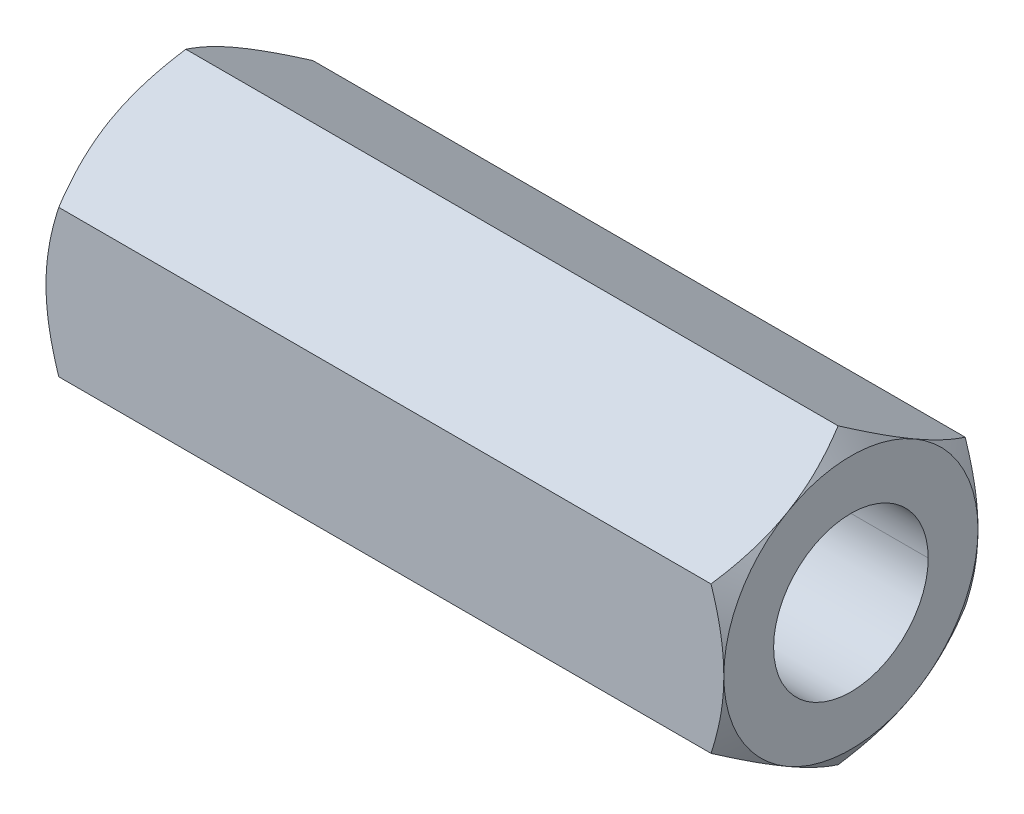
ISO-10303-21;
HEADER;
FILE_DESCRIPTION(('STEP AP214'),'2;1');
FILE_NAME('part.step','',(''),(''),'','','');
FILE_SCHEMA(('AUTOMOTIVE_DESIGN { 1 0 10303 214 1 1 1 1 }'));
ENDSEC;
DATA;
#1=APPLICATION_CONTEXT('core data for automotive mechanical design processes');
#2=APPLICATION_PROTOCOL_DEFINITION('international standard','automotive_design',2000,#1);
#3=PRODUCT_CONTEXT('',#1,'mechanical');
#4=PRODUCT('Part','Part','',(#3));
#5=PRODUCT_RELATED_PRODUCT_CATEGORY('part','',(#4));
#6=PRODUCT_DEFINITION_FORMATION('','',#4);
#7=PRODUCT_DEFINITION_CONTEXT('part definition',#1,'design');
#8=PRODUCT_DEFINITION('design','',#6,#7);
#9=PRODUCT_DEFINITION_SHAPE('','',#8);
#10=(LENGTH_UNIT() NAMED_UNIT(*) SI_UNIT(.MILLI.,.METRE.));
#11=(NAMED_UNIT(*) PLANE_ANGLE_UNIT() SI_UNIT($,.RADIAN.));
#12=(NAMED_UNIT(*) SI_UNIT($,.STERADIAN.) SOLID_ANGLE_UNIT());
#13=UNCERTAINTY_MEASURE_WITH_UNIT(LENGTH_MEASURE(1.E-05),#10,'distance_accuracy_value','');
#14=(GEOMETRIC_REPRESENTATION_CONTEXT(3) GLOBAL_UNCERTAINTY_ASSIGNED_CONTEXT((#13)) GLOBAL_UNIT_ASSIGNED_CONTEXT((#10,
#11,#12)) REPRESENTATION_CONTEXT('',''));
#15=CARTESIAN_POINT('',(0.,0.,0.));
#16=DIRECTION('',(0.,0.,1.));
#17=DIRECTION('',(1.,0.,0.));
#18=AXIS2_PLACEMENT_3D('',#15,#16,#17);
#19=CARTESIAN_POINT('',(-8.,0.,0.));
#20=DIRECTION('',(1.,0.,0.));
#21=DIRECTION('',(0.,0.,-1.));
#22=AXIS2_PLACEMENT_3D('',#19,#20,#21);
#23=CYLINDRICAL_SURFACE('',#22,1.825);
#24=CARTESIAN_POINT('',(-8.,0.,0.));
#25=DIRECTION('',(1.,0.,0.));
#26=DIRECTION('',(0.,0.,-1.));
#27=AXIS2_PLACEMENT_3D('',#24,#25,#26);
#28=CIRCLE('',#27,1.825);
#29=CARTESIAN_POINT('',(-8.,0.,1.825));
#30=VERTEX_POINT('',#29);
#31=CARTESIAN_POINT('',(-8.,0.,-1.825));
#32=VERTEX_POINT('',#31);
#33=EDGE_CURVE('E45',#30,#32,#28,.T.);
#34=ORIENTED_EDGE('',*,*,#33,.F.);
#35=DIRECTION('',(1.,0.,0.));
#36=VECTOR('',#35,1.);
#37=CARTESIAN_POINT('',(-8.,0.,1.825));
#38=LINE('',#37,#36);
#39=CARTESIAN_POINT('',(8.,0.,1.825));
#40=VERTEX_POINT('',#39);
#41=EDGE_CURVE('E11',#30,#40,#38,.T.);
#42=ORIENTED_EDGE('',*,*,#41,.T.);
#43=CARTESIAN_POINT('',(8.,0.,0.));
#44=DIRECTION('',(1.,0.,0.));
#45=DIRECTION('',(0.,0.,-1.));
#46=AXIS2_PLACEMENT_3D('',#43,#44,#45);
#47=CIRCLE('',#46,1.825);
#48=CARTESIAN_POINT('',(8.,0.,-1.825));
#49=VERTEX_POINT('',#48);
#50=EDGE_CURVE('E31',#40,#49,#47,.T.);
#51=ORIENTED_EDGE('',*,*,#50,.T.);
#52=DIRECTION('',(1.,0.,0.));
#53=VECTOR('',#52,1.);
#54=CARTESIAN_POINT('',(-8.,0.,-1.825));
#55=LINE('',#54,#53);
#56=EDGE_CURVE('E1012',#32,#49,#55,.T.);
#57=ORIENTED_EDGE('',*,*,#56,.F.);
#58=EDGE_LOOP('',(#34,#42,#51,#57));
#59=FACE_BOUND('',#58,.T.);
#60=ADVANCED_FACE('F17',(#59),#23,.F.);
#61=CARTESIAN_POINT('',(8.,-3.46410161513775,0.));
#62=DIRECTION('',(0.,0.866025403784439,0.5));
#63=DIRECTION('',(1.,0.,0.));
#64=AXIS2_PLACEMENT_3D('',#61,#62,#63);
#65=PLANE('',#64);
#66=DIRECTION('',(-1.,0.,0.));
#67=VECTOR('',#66,1.);
#68=CARTESIAN_POINT('',(8.,-3.46410161513775,0.));
#69=LINE('',#68,#67);
#70=CARTESIAN_POINT('',(7.69860888711432,-3.46410161513775,0.));
#71=VERTEX_POINT('',#70);
#72=CARTESIAN_POINT('',(-7.69860888711432,-3.46410161513775,0.));
#73=VERTEX_POINT('',#72);
#74=EDGE_CURVE('E967',#71,#73,#69,.T.);
#75=ORIENTED_EDGE('',*,*,#74,.T.);
#76=CARTESIAN_POINT('',(-7.6986088871143,-3.46410161513775,0.));
#77=CARTESIAN_POINT('',(-8.,-3.,-0.803847577293372));
#78=CARTESIAN_POINT('',(-8.,-2.59807621135331,-1.5));
#79=B_SPLINE_CURVE_WITH_KNOTS('',2,(#76,#77,#78),.UNSPECIFIED.,.F.,.F.,(3,3),(0.,1.),.UNSPECIFIED.);
#80=CARTESIAN_POINT('',(-8.,-2.59807621135332,-1.5));
#81=VERTEX_POINT('',#80);
#82=EDGE_CURVE('E101',#73,#81,#79,.T.);
#83=ORIENTED_EDGE('',*,*,#82,.T.);
#84=CARTESIAN_POINT('',(-8.,-2.59807621135331,-1.5));
#85=CARTESIAN_POINT('',(-8.,-2.38307063167361,-1.87240058791605));
#86=CARTESIAN_POINT('',(-7.91816527368335,-2.15876817497553,-2.26090383917965));
#87=CARTESIAN_POINT('',(-7.84437168332405,-1.9565058304775,-2.61123249630823));
#88=CARTESIAN_POINT('',(-7.6986088871143,-1.73205080756888,-3.));
#89=B_SPLINE_CURVE_WITH_KNOTS('',2,(#84,#85,#86,#87,#88),.UNSPECIFIED.,.F.,.F.,(3,2,3),(0.,0.5,
1.),.UNSPECIFIED.);
#90=CARTESIAN_POINT('',(-7.69860888711432,-1.73205080756888,-3.));
#91=VERTEX_POINT('',#90);
#92=EDGE_CURVE('E206',#81,#91,#89,.T.);
#93=ORIENTED_EDGE('',*,*,#92,.T.);
#94=DIRECTION('',(-1.,0.,0.));
#95=VECTOR('',#94,1.);
#96=CARTESIAN_POINT('',(8.,-1.73205080756888,-3.));
#97=LINE('',#96,#95);
#98=CARTESIAN_POINT('',(7.69860888711432,-1.73205080756888,-3.));
#99=VERTEX_POINT('',#98);
#100=EDGE_CURVE('E198',#99,#91,#97,.T.);
#101=ORIENTED_EDGE('',*,*,#100,.F.);
#102=CARTESIAN_POINT('',(8.,-2.59807621135332,-1.5));
#103=CARTESIAN_POINT('',(8.00000668770885,-2.57357654240966,-1.54242358281842));
#104=CARTESIAN_POINT('',(7.99922208456361,-2.54908514766891,-1.58485110657827));
#105=CARTESIAN_POINT('',(7.99609531450641,-2.50009687637861,-1.66973638484576));
#106=CARTESIAN_POINT('',(7.99375065597124,-2.47560005382788,-1.71219407900429));
#107=CARTESIAN_POINT('',(7.987506156376,-2.4264781959663,-1.79733662231277));
#108=CARTESIAN_POINT('',(7.98359504905546,-2.4018535359428,-1.84002085718737));
#109=CARTESIAN_POINT('',(7.97434940652958,-2.35299148290801,-1.92465196827287));
#110=CARTESIAN_POINT('',(7.9690356246405,-2.32875350620946,-1.96660078378919));
#111=CARTESIAN_POINT('',(7.95696557695606,-2.28026349772503,-2.05052808758778));
#112=CARTESIAN_POINT('',(7.95020316558772,-2.25601185941017,-2.09250591803929));
#113=CARTESIAN_POINT('',(7.93524130197941,-2.20741041099833,-2.17666020723114));
#114=CARTESIAN_POINT('',(7.92702953600647,-2.183061663325,-2.21883508372545));
#115=CARTESIAN_POINT('',(7.90965251967789,-2.13543803393131,-2.30130437714191));
#116=CARTESIAN_POINT('',(7.90053799217868,-2.11215885653826,-2.34160704355432));
#117=CARTESIAN_POINT('',(7.88108195642983,-2.0654992712674,-2.42237906282791));
#118=CARTESIAN_POINT('',(7.87072980917081,-2.04211994051492,-2.46284647104154));
#119=CARTESIAN_POINT('',(7.84879950670193,-1.99521009763143,-2.54406241349638));
#120=CARTESIAN_POINT('',(7.83720780515647,-1.97168127729455,-2.58480825923333));
#121=CARTESIAN_POINT('',(7.81280165188564,-1.92441487089124,-2.66668178398353));
#122=CARTESIAN_POINT('',(7.79997145708131,-1.90067945298525,-2.70780601310698));
#123=CARTESIAN_POINT('',(7.77309034307413,-1.85294284974835,-2.79052616823769));
#124=CARTESIAN_POINT('',(7.75902211740142,-1.82894419039809,-2.83211791230945));
#125=CARTESIAN_POINT('',(7.72966547522165,-1.78062341708416,-2.91585305940456));
#126=CARTESIAN_POINT('',(7.71435874344516,-1.75630400492688,-2.95799160781338));
#127=CARTESIAN_POINT('',(7.69860888711431,-1.73205080756888,-3.));
#128=B_SPLINE_CURVE_WITH_KNOTS('',3,(#102,#103,#104,#105,#106,#107,#108,#109,#110,#111,#112,
#113,#114,#115,#116,#117,#118,#119,#120,#121,#122,#123,#124,#125,#126,#127),.UNSPECIFIED.,.F.,
.F.,(4,2,2,2,2,2,2,2,2,2,2,2,4),(0.,0.146961653174103,0.294158589564485,0.442433777639722,
0.588627431092255,0.735454024048491,0.883594034806672,1.02585962036433,1.16945048307982,
1.31481233638111,1.46235627221792,1.61245801805119,1.7654580267022),.UNSPECIFIED.);
#129=CARTESIAN_POINT('',(8.,-2.59807621135332,-1.5));
#130=VERTEX_POINT('',#129);
#131=EDGE_CURVE('E312',#130,#99,#128,.T.);
#132=ORIENTED_EDGE('',*,*,#131,.F.);
#133=CARTESIAN_POINT('',(7.69860888711432,-3.46410161513775,0.));
#134=CARTESIAN_POINT('',(7.72214042806536,-3.42786230534229,-0.0627598032670729));
#135=CARTESIAN_POINT('',(7.74467788046851,-3.39145621691702,-0.125807267244589));
#136=CARTESIAN_POINT('',(7.78690475539418,-3.31928295390511,-0.250821442873597));
#137=CARTESIAN_POINT('',(7.80665346465305,-3.28352413650513,-0.31277300598855));
#138=CARTESIAN_POINT('',(7.8433121632418,-3.21248069969049,-0.435904740322739));
#139=CARTESIAN_POINT('',(7.86027390144529,-3.17720233208865,-0.497073006088292));
#140=CARTESIAN_POINT('',(7.89135569861476,-3.10692021733843,-0.618973886627668));
#141=CARTESIAN_POINT('',(7.9055154548172,-3.07192059297009,-0.679698729951774));
#142=CARTESIAN_POINT('',(7.93177028595205,-2.99988257504773,-0.804448156271327));
#143=CARTESIAN_POINT('',(7.94373321186077,-2.96282712230773,-0.868490905476807));
#144=CARTESIAN_POINT('',(7.96418231022845,-2.88923500665739,-0.995657557164593));
#145=CARTESIAN_POINT('',(7.97273442423833,-2.85270317952852,-1.05877355533627));
#146=CARTESIAN_POINT('',(7.98636908076047,-2.77990617811073,-1.18474584845464));
#147=CARTESIAN_POINT('',(7.9914831564021,-2.74364168430989,-1.24759909814034));
#148=CARTESIAN_POINT('',(7.99831848971539,-2.6709507452069,-1.37363815790066));
#149=CARTESIAN_POINT('',(8.00002991979687,-2.63452413446726,-1.43682440429886));
#150=CARTESIAN_POINT('',(8.,-2.59807621135332,-1.5));
#151=B_SPLINE_CURVE_WITH_KNOTS('',3,(#133,#134,#135,#136,#137,#138,#139,#140,#141,#142,#143,
#144,#145,#146,#147,#148,#149,#150),.UNSPECIFIED.,.F.,.F.,(4,2,2,2,2,2,2,2,4),(0.,
0.228593999055857,0.451179758825042,0.668997226223066,0.883464246540132,1.10825199294573,
1.32845450015987,1.54660873914061,1.76539214559652),.UNSPECIFIED.);
#152=EDGE_CURVE('E559',#71,#130,#151,.T.);
#153=ORIENTED_EDGE('',*,*,#152,.F.);
#154=EDGE_LOOP('',(#75,#83,#93,#101,#132,#153));
#155=FACE_BOUND('',#154,.T.);
#156=ADVANCED_FACE('F227',(#155),#65,.F.);
#157=CARTESIAN_POINT('',(8.,-1.73205080756888,-3.));
#158=DIRECTION('',(0.,0.,1.));
#159=DIRECTION('',(0.,-1.,0.));
#160=AXIS2_PLACEMENT_3D('',#157,#158,#159);
#161=PLANE('',#160);
#162=ORIENTED_EDGE('',*,*,#100,.T.);
#163=CARTESIAN_POINT('',(-7.6986088871143,-1.73205080756888,-3.));
#164=CARTESIAN_POINT('',(-7.84497464209585,-1.28128381157237,-3.));
#165=CARTESIAN_POINT('',(-7.91898523623235,-0.874113143900575,-3.));
#166=CARTESIAN_POINT('',(-8.,-0.428408906021974,-3.));
#167=CARTESIAN_POINT('',(-8.,0.,-3.));
#168=B_SPLINE_CURVE_WITH_KNOTS('',2,(#163,#164,#165,#166,#167),.UNSPECIFIED.,.F.,.F.,(3,2,3),
(0.,0.5,1.),.UNSPECIFIED.);
#169=CARTESIAN_POINT('',(-8.,0.,-3.));
#170=VERTEX_POINT('',#169);
#171=EDGE_CURVE('E189',#91,#170,#168,.T.);
#172=ORIENTED_EDGE('',*,*,#171,.T.);
#173=CARTESIAN_POINT('',(-8.,0.,-3.));
#174=CARTESIAN_POINT('',(-8.,0.431128543948385,-3.));
#175=CARTESIAN_POINT('',(-7.91772972012265,0.88099934693481,-3.));
#176=CARTESIAN_POINT('',(-7.84395108489505,1.28443609131611,-3.));
#177=CARTESIAN_POINT('',(-7.6986088871143,1.73205080756888,-3.));
#178=B_SPLINE_CURVE_WITH_KNOTS('',2,(#173,#174,#175,#176,#177),.UNSPECIFIED.,.F.,.F.,(3,2,3),
(0.,0.5,1.),.UNSPECIFIED.);
#179=CARTESIAN_POINT('',(-7.69860888711432,1.73205080756888,-3.));
#180=VERTEX_POINT('',#179);
#181=EDGE_CURVE('E179',#170,#180,#178,.T.);
#182=ORIENTED_EDGE('',*,*,#181,.T.);
#183=DIRECTION('',(-1.,0.,0.));
#184=VECTOR('',#183,1.);
#185=CARTESIAN_POINT('',(8.,1.73205080756888,-3.));
#186=LINE('',#185,#184);
#187=CARTESIAN_POINT('',(7.69860888711432,1.73205080756888,-3.));
#188=VERTEX_POINT('',#187);
#189=EDGE_CURVE('E190',#188,#180,#186,.T.);
#190=ORIENTED_EDGE('',*,*,#189,.F.);
#191=CARTESIAN_POINT('',(8.,0.,-3.));
#192=CARTESIAN_POINT('',(8.00003043452937,0.0733790126234527,-2.99997674807486));
#193=CARTESIAN_POINT('',(7.9983079544071,0.146757068789994,-2.99991409226994));
#194=CARTESIAN_POINT('',(7.99142171646038,0.293064984675756,-2.99980140858203));
#195=CARTESIAN_POINT('',(7.98627140726917,0.365995476228719,-2.99975133239803));
#196=CARTESIAN_POINT('',(7.97253578031013,0.512150558800236,-2.99975365322483));
#197=CARTESIAN_POINT('',(7.96392186168187,0.585372443555909,-2.999806917944));
#198=CARTESIAN_POINT('',(7.94332043012325,0.732826851424092,-2.99992360843881));
#199=CARTESIAN_POINT('',(7.93126899024364,0.807050361394054,-2.99998721586619));
#200=CARTESIAN_POINT('',(7.90492510842791,0.950935764230867,-3.00001209045006));
#201=CARTESIAN_POINT('',(7.89078974910213,1.02062664092446,-2.99997872344426));
#202=CARTESIAN_POINT('',(7.85977563655771,1.16058570669911,-2.9999371755243));
#203=CARTESIAN_POINT('',(7.84285593100607,1.23084479675351,-2.99992941390095));
#204=CARTESIAN_POINT('',(7.80629855247616,1.37233625656728,-2.99993578384478));
#205=CARTESIAN_POINT('',(7.78660827734786,1.44355494137011,-2.99995041209135));
#206=CARTESIAN_POINT('',(7.7445150517809,1.58732037207006,-2.99998061711559));
#207=CARTESIAN_POINT('',(7.72205231790221,1.65984966013444,-2.9999962089219));
#208=CARTESIAN_POINT('',(7.69860888711432,1.73205080756887,-3.));
#209=B_SPLINE_CURVE_WITH_KNOTS('',3,(#191,#192,#193,#194,#195,#196,#197,#198,#199,#200,#201,
#202,#203,#204,#205,#206,#207,#208),.UNSPECIFIED.,.F.,.F.,(4,2,2,2,2,2,2,2,4),(0.,
0.220114082957594,0.439369628524209,0.660474136452737,0.885993481755066,1.09927585373177,
1.31603385344403,1.53767040203616,1.76541224828103),.UNSPECIFIED.);
#210=CARTESIAN_POINT('',(8.,0.,-3.));
#211=VERTEX_POINT('',#210);
#212=EDGE_CURVE('E511',#211,#188,#209,.T.);
#213=ORIENTED_EDGE('',*,*,#212,.F.);
#214=CARTESIAN_POINT('',(7.69860888711431,-1.73205080756888,-3.));
#215=CARTESIAN_POINT('',(7.72224243307661,-1.65926400029357,-2.99999617070729));
#216=CARTESIAN_POINT('',(7.74487935423427,-1.58614353069288,-2.9999804750425));
#217=CARTESIAN_POINT('',(7.78727387453292,-1.4412132083385,-2.99995038638742));
#218=CARTESIAN_POINT('',(7.80709267242283,-1.36942120913343,-2.99993596967822));
#219=CARTESIAN_POINT('',(7.84386010112498,-1.2267913836066,-2.99993072327983));
#220=CARTESIAN_POINT('',(7.86086245489469,-1.15596750281588,-2.99993937968137));
#221=CARTESIAN_POINT('',(7.89199587364281,-1.01487675734019,-2.9999809167109));
#222=CARTESIAN_POINT('',(7.90616849686383,-0.944619089454432,-3.00001340784867));
#223=CARTESIAN_POINT('',(7.93232009311066,-0.800756990982115,-2.99998605013819));
#224=CARTESIAN_POINT('',(7.94418722698718,-0.727132081382443,-2.99992241534352));
#225=CARTESIAN_POINT('',(7.96447408135278,-0.580848484455957,-2.99980774115738));
#226=CARTESIAN_POINT('',(7.97295574499778,-0.508198466217709,-2.99975648295982));
#227=CARTESIAN_POINT('',(7.98648136217487,-0.363176091265482,-2.99975556975173));
#228=CARTESIAN_POINT('',(7.99155285122058,-0.290806319657638,-2.99980508758923));
#229=CARTESIAN_POINT('',(7.99833358253277,-0.145625078466702,-2.99991597711545));
#230=CARTESIAN_POINT('',(8.00002955176189,-0.0728129900496485,-2.99997739456125));
#231=CARTESIAN_POINT('',(8.,0.,-3.));
#232=B_SPLINE_CURVE_WITH_KNOTS('',3,(#214,#215,#216,#217,#218,#219,#220,#221,#222,#223,#224,
#225,#226,#227,#228,#229,#230,#231),.UNSPECIFIED.,.F.,.F.,(4,2,2,2,2,2,2,2,4),(0.,
0.229589406595602,0.452985527156155,0.671447733710569,0.886417339807962,1.11007710599967,
1.32943306977746,1.54699586049821,1.76541246298202),.UNSPECIFIED.);
#233=EDGE_CURVE('E280',#99,#211,#232,.T.);
#234=ORIENTED_EDGE('',*,*,#233,.F.);
#235=EDGE_LOOP('',(#162,#172,#182,#190,#213,#234));
#236=FACE_BOUND('',#235,.T.);
#237=ADVANCED_FACE('F195',(#236),#161,.F.);
#238=CARTESIAN_POINT('',(8.,1.73205080756888,-3.));
#239=DIRECTION('',(0.,-0.866025403784439,0.5));
#240=DIRECTION('',(-1.,0.,0.));
#241=AXIS2_PLACEMENT_3D('',#238,#239,#240);
#242=PLANE('',#241);
#243=ORIENTED_EDGE('',*,*,#189,.T.);
#244=CARTESIAN_POINT('',(-7.6986088871143,1.73205080756888,-3.));
#245=CARTESIAN_POINT('',(-8.,2.19615242270664,-2.19615242270663));
#246=CARTESIAN_POINT('',(-8.,2.59807621135332,-1.5));
#247=B_SPLINE_CURVE_WITH_KNOTS('',2,(#244,#245,#246),.UNSPECIFIED.,.F.,.F.,(3,3),(0.,1.),.UNSPECIFIED.);
#248=CARTESIAN_POINT('',(-8.,2.59807621135332,-1.5));
#249=VERTEX_POINT('',#248);
#250=EDGE_CURVE('E183',#180,#249,#247,.T.);
#251=ORIENTED_EDGE('',*,*,#250,.T.);
#252=CARTESIAN_POINT('',(-8.,2.59807621135332,-1.5));
#253=CARTESIAN_POINT('',(-8.,2.81308179103284,-1.12759941208427));
#254=CARTESIAN_POINT('',(-7.91816527368335,3.03738424773111,-0.739096160820353));
#255=CARTESIAN_POINT('',(-7.8443716833242,3.23964659222894,-0.388767503692107));
#256=CARTESIAN_POINT('',(-7.6986088871143,3.46410161513776,0.));
#257=B_SPLINE_CURVE_WITH_KNOTS('',2,(#252,#253,#254,#255,#256),.UNSPECIFIED.,.F.,.F.,(3,2,3),
(0.,0.5,1.),.UNSPECIFIED.);
#258=CARTESIAN_POINT('',(-7.69860888711431,3.46410161513775,0.));
#259=VERTEX_POINT('',#258);
#260=EDGE_CURVE('E961',#249,#259,#257,.T.);
#261=ORIENTED_EDGE('',*,*,#260,.T.);
#262=DIRECTION('',(-1.,0.,0.));
#263=VECTOR('',#262,1.);
#264=CARTESIAN_POINT('',(8.,3.46410161513775,0.));
#265=LINE('',#264,#263);
#266=CARTESIAN_POINT('',(7.69860888711431,3.46410161513775,0.));
#267=VERTEX_POINT('',#266);
#268=EDGE_CURVE('E619',#267,#259,#265,.T.);
#269=ORIENTED_EDGE('',*,*,#268,.F.);
#270=CARTESIAN_POINT('',(8.,2.59807621135332,-1.5));
#271=CARTESIAN_POINT('',(8.00000668770886,2.62256627732135,-1.45757087290201));
#272=CARTESIAN_POINT('',(7.9992220845636,2.6470638933463,-1.41514694100326));
#273=CARTESIAN_POINT('',(7.99609531450639,2.69608256508781,-1.33027921444545));
#274=CARTESIAN_POINT('',(7.99375065597121,2.7206035955399,-1.28783549672529));
#275=CARTESIAN_POINT('',(7.98750615637598,2.76977827205747,-1.20272344828107));
#276=CARTESIAN_POINT('',(7.98359504905546,2.79443157378857,-1.16005574970307));
#277=CARTESIAN_POINT('',(7.97434940652968,2.84329323942184,-1.07542441495039));
#278=CARTESIAN_POINT('',(7.96903562464072,2.86750299096816,-1.03345930363501));
#279=CARTESIAN_POINT('',(7.95696557695639,2.91594116388646,-0.949502072558531));
#280=CARTESIAN_POINT('',(7.95020316558804,2.94016921229581,-0.907510622468735));
#281=CARTESIAN_POINT('',(7.93524130197963,2.98874824036766,-0.823343388887376));
#282=CARTESIAN_POINT('',(7.92702953600657,3.01309838097673,-0.781169316604703));
#283=CARTESIAN_POINT('',(7.90965251967773,3.06070706941119,-0.698691397020739));
#284=CARTESIAN_POINT('',(7.90053799217837,3.08397061366838,-0.658379704812649));
#285=CARTESIAN_POINT('',(7.88108195642927,3.1305914416393,-0.577585309000707));
#286=CARTESIAN_POINT('',(7.87072980917017,3.15394757980154,-0.537104510538544));
#287=CARTESIAN_POINT('',(7.84879950670117,3.20082772771816,-0.455871423686163));
#288=CARTESIAN_POINT('',(7.83720780515568,3.22435025505664,-0.415121944684775));
#289=CARTESIAN_POINT('',(7.81280165188485,3.27162160418597,-0.333251273618755));
#290=CARTESIAN_POINT('',(7.79997145708056,3.29536852236486,-0.292133684181036));
#291=CARTESIAN_POINT('',(7.77309034307349,3.34313797649434,-0.209432495522389));
#292=CARTESIAN_POINT('',(7.75902211740087,3.36715815377288,-0.167853174832621));
#293=CARTESIAN_POINT('',(7.72966547522134,3.41551453168949,-0.084138584065276));
#294=CARTESIAN_POINT('',(7.71435874344501,3.43984787901123,-0.0420080811279386));
#295=CARTESIAN_POINT('',(7.69860888711431,3.46410161513776,0.));
#296=B_SPLINE_CURVE_WITH_KNOTS('',3,(#270,#271,#272,#273,#274,#275,#276,#277,#278,#279,#280,
#281,#282,#283,#284,#285,#286,#287,#288,#289,#290,#291,#292,#293,#294,#295),.UNSPECIFIED.,.F.,
.F.,(4,2,2,2,2,2,2,2,2,2,2,2,4),(0.,0.146961653171529,0.294158589561915,0.442433777639721,
0.588627431091759,0.735454024047977,0.883594034806682,1.02585962036567,1.16945048308201,
1.31481233638362,1.46235627222018,1.61245801805262,1.76545802670219),.UNSPECIFIED.);
#297=CARTESIAN_POINT('',(8.,2.59807621135332,-1.5));
#298=VERTEX_POINT('',#297);
#299=EDGE_CURVE('E470',#298,#267,#296,.T.);
#300=ORIENTED_EDGE('',*,*,#299,.F.);
#301=CARTESIAN_POINT('',(7.69860888711432,1.73205080756887,-3.));
#302=CARTESIAN_POINT('',(7.72214042806547,1.76828273663709,-2.9372359354677));
#303=CARTESIAN_POINT('',(7.74467788046873,1.80468039787331,-2.87418360604994));
#304=CARTESIAN_POINT('',(7.78690475539454,1.8768592182954,-2.74917263899271));
#305=CARTESIAN_POINT('',(7.80665346465345,1.91263143705712,-2.68722881315745));
#306=CARTESIAN_POINT('',(7.8433121632422,1.98374492859518,-2.56413752493672));
#307=CARTESIAN_POINT('',(7.86027390144567,2.01907901685259,-2.50300142950679));
#308=CARTESIAN_POINT('',(7.89135569861498,2.08950721876812,-2.38118489243211));
#309=CARTESIAN_POINT('',(7.90551545481731,2.12459666354337,-2.32051190694447));
#310=CARTESIAN_POINT('',(7.93177028595206,2.19661382688262,-2.19575044022573));
#311=CARTESIAN_POINT('',(7.94373321186076,2.23354874825299,-2.13163810220118));
#312=CARTESIAN_POINT('',(7.96418231022842,2.30688224130392,-2.00432213468552));
#313=CARTESIAN_POINT('',(7.97273442423831,2.3432763855414,-1.94112664525931));
#314=CARTESIAN_POINT('',(7.98636908076046,2.41597309084594,-1.81509644615296));
#315=CARTESIAN_POINT('',(7.99148315640209,2.45227335488365,-1.75226384842327));
#316=CARTESIAN_POINT('',(7.99831848971538,2.52508091295343,-1.6262921186553));
#317=CARTESIAN_POINT('',(8.00002991979687,2.56158850213404,-1.56315262518216));
#318=CARTESIAN_POINT('',(8.,2.59807621135332,-1.5));
#319=B_SPLINE_CURVE_WITH_KNOTS('',3,(#301,#302,#303,#304,#305,#306,#307,#308,#309,#310,#311,
#312,#313,#314,#315,#316,#317,#318),.UNSPECIFIED.,.F.,.F.,(4,2,2,2,2,2,2,2,4),(0.,
0.228593999056885,0.451179758826377,0.668997226224037,0.883464246540144,1.10825199294667,
1.32845450016114,1.54660873914156,1.76539214559652),.UNSPECIFIED.);
#320=EDGE_CURVE('E266',#188,#298,#319,.T.);
#321=ORIENTED_EDGE('',*,*,#320,.F.);
#322=EDGE_LOOP('',(#243,#251,#261,#269,#300,#321));
#323=FACE_BOUND('',#322,.T.);
#324=ADVANCED_FACE('F437',(#323),#242,.F.);
#325=CARTESIAN_POINT('',(8.,3.46410161513775,0.));
#326=DIRECTION('',(0.,-0.866025403784439,-0.5));
#327=DIRECTION('',(0.,0.5,-0.866025403784439));
#328=AXIS2_PLACEMENT_3D('',#325,#326,#327);
#329=PLANE('',#328);
#330=ORIENTED_EDGE('',*,*,#268,.T.);
#331=CARTESIAN_POINT('',(-7.6986088871143,3.46410161513775,0.));
#332=CARTESIAN_POINT('',(-8.00000000000001,3.,0.803847577293376));
#333=CARTESIAN_POINT('',(-8.00000000000001,2.59807621135332,1.5));
#334=B_SPLINE_CURVE_WITH_KNOTS('',2,(#331,#332,#333),.UNSPECIFIED.,.F.,.F.,(3,3),(0.,1.),.UNSPECIFIED.);
#335=CARTESIAN_POINT('',(-8.,2.59807621135332,1.5));
#336=VERTEX_POINT('',#335);
#337=EDGE_CURVE('E981',#259,#336,#334,.T.);
#338=ORIENTED_EDGE('',*,*,#337,.T.);
#339=CARTESIAN_POINT('',(-8.00000000000001,2.59807621135332,1.5));
#340=CARTESIAN_POINT('',(-8.00000000000001,2.38307063167334,1.87240058791652));
#341=CARTESIAN_POINT('',(-7.91816527368336,2.15876817497553,2.26090383917965));
#342=CARTESIAN_POINT('',(-7.84437168332386,1.95650583047716,2.61123249630882));
#343=CARTESIAN_POINT('',(-7.6986088871143,1.73205080756888,3.));
#344=B_SPLINE_CURVE_WITH_KNOTS('',2,(#339,#340,#341,#342,#343),.UNSPECIFIED.,.F.,.F.,(3,2,3),
(0.,0.5,1.),.UNSPECIFIED.);
#345=CARTESIAN_POINT('',(-7.69860888711431,1.73205080756888,3.));
#346=VERTEX_POINT('',#345);
#347=EDGE_CURVE('E936',#336,#346,#344,.T.);
#348=ORIENTED_EDGE('',*,*,#347,.T.);
#349=DIRECTION('',(-1.,0.,0.));
#350=VECTOR('',#349,1.);
#351=CARTESIAN_POINT('',(8.,1.73205080756888,3.));
#352=LINE('',#351,#350);
#353=CARTESIAN_POINT('',(7.69860888711431,1.73205080756888,3.));
#354=VERTEX_POINT('',#353);
#355=EDGE_CURVE('E932',#354,#346,#352,.T.);
#356=ORIENTED_EDGE('',*,*,#355,.F.);
#357=CARTESIAN_POINT('',(8.,2.59807621135331,1.5));
#358=CARTESIAN_POINT('',(8.00000668770887,2.57357654241003,1.54242358281773));
#359=CARTESIAN_POINT('',(7.99922208456361,2.54908514766973,1.58485110657692));
#360=CARTESIAN_POINT('',(7.99609531450639,2.50009687637996,1.6697363848438));
#361=CARTESIAN_POINT('',(7.9937506559712,2.47560005382929,1.71219407900236));
#362=CARTESIAN_POINT('',(7.98750615637599,2.42647819596727,1.79733662231151));
#363=CARTESIAN_POINT('',(7.98359504905548,2.40185353594326,1.84002085718674));
#364=CARTESIAN_POINT('',(7.97434940652983,2.35299148290896,1.92465196827107));
#365=CARTESIAN_POINT('',(7.96903562464103,2.32875350621139,1.9666007837856));
#366=CARTESIAN_POINT('',(7.95696557695687,2.28026349772811,2.05052808758249));
#367=CARTESIAN_POINT('',(7.95020316558848,2.25601185941343,2.09250591803407));
#368=CARTESIAN_POINT('',(7.93524130197992,2.20741041100064,2.17666020722772));
#369=CARTESIAN_POINT('',(7.92702953600673,2.18306166332619,2.21883508372376));
#370=CARTESIAN_POINT('',(7.90965251967814,2.13543803393154,2.30130437714115));
#371=CARTESIAN_POINT('',(7.90053799217924,2.11215885653867,2.34160704355279));
#372=CARTESIAN_POINT('',(7.88108195643085,2.06549927126819,2.42237906282516));
#373=CARTESIAN_POINT('',(7.87072980917198,2.04211994051593,2.46284647103836));
#374=CARTESIAN_POINT('',(7.84879950670331,1.99521009763278,2.54406241349263));
#375=CARTESIAN_POINT('',(7.8372078051579,1.97168127729603,2.58480825922944));
#376=CARTESIAN_POINT('',(7.81280165188707,1.92441487089285,2.66668178397965));
#377=CARTESIAN_POINT('',(7.79997145708268,1.90067945298687,2.70780601310327));
#378=CARTESIAN_POINT('',(7.77309034307528,1.85294284974982,2.79052616823459));
#379=CARTESIAN_POINT('',(7.7590221174024,1.82894419039941,2.83211791230681));
#380=CARTESIAN_POINT('',(7.72966547522219,1.78062341708495,2.91585305940311));
#381=CARTESIAN_POINT('',(7.71435874344543,1.75630400492729,2.95799160781267));
#382=CARTESIAN_POINT('',(7.69860888711431,1.73205080756887,3.00000000000001));
#383=B_SPLINE_CURVE_WITH_KNOTS('',3,(#357,#358,#359,#360,#361,#362,#363,#364,#365,#366,#367,
#368,#369,#370,#371,#372,#373,#374,#375,#376,#377,#378,#379,#380,#381,#382),.UNSPECIFIED.,.F.,
.F.,(4,2,2,2,2,2,2,2,2,2,2,2,4),(0.,0.146961653171731,0.294158589562113,0.442433777639722,
0.588627431086084,0.735454024042261,0.88359403480665,1.0258596203619,1.16945048307587,
1.31481233637659,1.46235627221383,1.6124580180486,1.76545802670222),.UNSPECIFIED.);
#384=CARTESIAN_POINT('',(8.,2.59807621135332,1.5));
#385=VERTEX_POINT('',#384);
#386=EDGE_CURVE('E421',#385,#354,#383,.T.);
#387=ORIENTED_EDGE('',*,*,#386,.F.);
#388=CARTESIAN_POINT('',(7.69860888711431,3.46410161513776,0.));
#389=CARTESIAN_POINT('',(7.72214042806457,3.42786230534352,0.0627598032649693));
#390=CARTESIAN_POINT('',(7.74467788046688,3.39145621691965,0.125807267240498));
#391=CARTESIAN_POINT('',(7.78690475539146,3.31928295390979,0.250821442867049));
#392=CARTESIAN_POINT('',(7.80665346465004,3.28352413651044,0.312773005981545));
#393=CARTESIAN_POINT('',(7.84331216323875,3.21248069969615,0.435904740316093));
#394=CARTESIAN_POINT('',(7.86027390144245,3.177202332094,0.497073006082476));
#395=CARTESIAN_POINT('',(7.89135569861306,3.1069202173418,0.618973886624326));
#396=CARTESIAN_POINT('',(7.90551545481639,3.07192059297178,0.679698729950092));
#397=CARTESIAN_POINT('',(7.93177028595203,2.99988257504836,0.80444815626893));
#398=CARTESIAN_POINT('',(7.94373321186083,2.96282712230898,0.868490905472012));
#399=CARTESIAN_POINT('',(7.96418231022859,2.88923500665981,0.995657557156807));
#400=CARTESIAN_POINT('',(7.97273442423841,2.85270317953147,1.05877355532789));
#401=CARTESIAN_POINT('',(7.98636908076054,2.77990617811411,1.18474584844652));
#402=CARTESIAN_POINT('',(7.99148315640213,2.74364168431317,1.24759909813307));
#403=CARTESIAN_POINT('',(7.99831848971543,2.67095074520907,1.37363815789643));
#404=CARTESIAN_POINT('',(8.00002991979688,2.63452413446843,1.4368244042968));
#405=CARTESIAN_POINT('',(8.,2.59807621135331,1.5));
#406=B_SPLINE_CURVE_WITH_KNOTS('',3,(#388,#389,#390,#391,#392,#393,#394,#395,#396,#397,#398,
#399,#400,#401,#402,#403,#404,#405),.UNSPECIFIED.,.F.,.F.,(4,2,2,2,2,2,2,2,4),(0.,
0.228593999048174,0.451179758815056,0.668997226215775,0.883464246540065,1.10825199293861,
1.3284545001504,1.54660873913352,1.76539214559656),.UNSPECIFIED.);
#407=EDGE_CURVE('E498',#267,#385,#406,.T.);
#408=ORIENTED_EDGE('',*,*,#407,.F.);
#409=EDGE_LOOP('',(#330,#338,#348,#356,#387,#408));
#410=FACE_BOUND('',#409,.T.);
#411=ADVANCED_FACE('F299',(#410),#329,.F.);
#412=CARTESIAN_POINT('',(8.,1.73205080756888,3.));
#413=DIRECTION('',(0.,0.,-1.));
#414=DIRECTION('',(-1.,0.,0.));
#415=AXIS2_PLACEMENT_3D('',#412,#413,#414);
#416=PLANE('',#415);
#417=ORIENTED_EDGE('',*,*,#355,.T.);
#418=CARTESIAN_POINT('',(-7.6986088871143,1.73205080756888,3.));
#419=CARTESIAN_POINT('',(-7.8437588440744,1.28502814112483,3.));
#420=CARTESIAN_POINT('',(-7.91772972012265,0.880999346934809,3.));
#421=CARTESIAN_POINT('',(-8.,0.431639223703878,3.));
#422=CARTESIAN_POINT('',(-8.,0.,3.));
#423=B_SPLINE_CURVE_WITH_KNOTS('',2,(#418,#419,#420,#421,#422),.UNSPECIFIED.,.F.,.F.,(3,2,3),
(0.,0.5,1.),.UNSPECIFIED.);
#424=CARTESIAN_POINT('',(-8.,0.,3.));
#425=VERTEX_POINT('',#424);
#426=EDGE_CURVE('E937',#346,#425,#423,.T.);
#427=ORIENTED_EDGE('',*,*,#426,.T.);
#428=CARTESIAN_POINT('',(-8.,0.,3.));
#429=CARTESIAN_POINT('',(-8.,-0.427899501991085,3.));
#430=CARTESIAN_POINT('',(-7.91898523623235,-0.87411314390057,3.));
#431=CARTESIAN_POINT('',(-7.8451663013176,-1.28069355293113,3.));
#432=CARTESIAN_POINT('',(-7.6986088871143,-1.73205080756887,3.));
#433=B_SPLINE_CURVE_WITH_KNOTS('',2,(#428,#429,#430,#431,#432),.UNSPECIFIED.,.F.,.F.,(3,2,3),
(0.,0.5,1.),.UNSPECIFIED.);
#434=CARTESIAN_POINT('',(-7.69860888711431,-1.73205080756888,3.));
#435=VERTEX_POINT('',#434);
#436=EDGE_CURVE('E951',#425,#435,#433,.T.);
#437=ORIENTED_EDGE('',*,*,#436,.T.);
#438=DIRECTION('',(-1.,0.,0.));
#439=VECTOR('',#438,1.);
#440=CARTESIAN_POINT('',(8.,-1.73205080756888,3.));
#441=LINE('',#440,#439);
#442=CARTESIAN_POINT('',(7.69860888711431,-1.73205080756888,3.));
#443=VERTEX_POINT('',#442);
#444=EDGE_CURVE('E948',#443,#435,#441,.T.);
#445=ORIENTED_EDGE('',*,*,#444,.F.);
#446=CARTESIAN_POINT('',(8.,0.,3.));
#447=CARTESIAN_POINT('',(8.00002952178075,-0.0728068356749455,2.99997743466067));
#448=CARTESIAN_POINT('',(7.99833347186238,-0.14561274869956,2.99991659586424));
#449=CARTESIAN_POINT('',(7.99155277060747,-0.290785763479766,2.99980715572441));
#450=CARTESIAN_POINT('',(7.98648120043659,-0.36315347513764,2.99975850813431));
#451=CARTESIAN_POINT('',(7.9729555264923,-0.508175830274935,2.99976070904412));
#452=CARTESIAN_POINT('',(7.96447370118976,-0.580827871018661,2.99981238658764));
#453=CARTESIAN_POINT('',(7.94418706432612,-0.727119708355152,2.99992581741281));
#454=CARTESIAN_POINT('',(7.93232015649358,-0.800750815106292,2.99998774892961));
#455=CARTESIAN_POINT('',(7.90617060186411,-0.944613109515814,3.00001177307286));
#456=CARTESIAN_POINT('',(7.8920002745858,-1.01486486172129,2.99997766681415));
#457=CARTESIAN_POINT('',(7.86086984179076,-1.15594746288003,2.99993488167702));
#458=CARTESIAN_POINT('',(7.84386802048011,-1.22676908053862,2.99992662641008));
#459=CARTESIAN_POINT('',(7.80710050287425,-1.3693985374679,2.99993310272072));
#460=CARTESIAN_POINT('',(7.78728093723664,-1.44119239283924,2.99994835906702));
#461=CARTESIAN_POINT('',(7.74488360131543,-1.58613090877846,2.9999798677915));
#462=CARTESIAN_POINT('',(7.72224449478166,-1.6592576755887,2.99999613606646));
#463=CARTESIAN_POINT('',(7.69860888711431,-1.73205080756888,3.));
#464=B_SPLINE_CURVE_WITH_KNOTS('',3,(#446,#447,#448,#449,#450,#451,#452,#453,#454,#455,#456,
#457,#458,#459,#460,#461,#462,#463),.UNSPECIFIED.,.F.,.F.,(4,2,2,2,2,2,2,2,4),(0.,
0.218398108540983,0.4359547480767,0.655316836015385,0.878994864161152,1.093945691818,
1.3124008941718,1.53580299921663,1.76541238058012),.UNSPECIFIED.);
#465=CARTESIAN_POINT('',(8.,0.,3.));
#466=VERTEX_POINT('',#465);
#467=EDGE_CURVE('E376',#466,#443,#464,.T.);
#468=ORIENTED_EDGE('',*,*,#467,.F.);
#469=CARTESIAN_POINT('',(7.69860888711431,1.73205080756887,3.00000000000001));
#470=CARTESIAN_POINT('',(7.7220502597674,1.65985597339005,2.99999624342151));
#471=CARTESIAN_POINT('',(7.74451081353755,1.58733297138272,2.99998121831004));
#472=CARTESIAN_POINT('',(7.78660122933916,1.44357572164843,2.99995241895449));
#473=CARTESIAN_POINT('',(7.80629073885738,1.37235889196048,2.99993862200154));
#474=CARTESIAN_POINT('',(7.84284802937627,1.23086706750285,2.99993347005255));
#475=CARTESIAN_POINT('',(7.85976826783763,1.16060571968878,2.99994162902516));
#476=CARTESIAN_POINT('',(7.89078535863189,1.02063852174968,2.99998194146383));
#477=CARTESIAN_POINT('',(7.90492300743511,0.950941736381222,3.00001370941953));
#478=CARTESIAN_POINT('',(7.93126892625671,0.807056528716694,2.99998550645576));
#479=CARTESIAN_POINT('',(7.94332059367443,0.732839207785386,2.99992018450919));
#480=CARTESIAN_POINT('',(7.96392224387292,0.585393029119474,2.99980224286588));
#481=CARTESIAN_POINT('',(7.97253600008935,0.512173163577416,2.99974940006866));
#482=CARTESIAN_POINT('',(7.98627157006071,0.366018060942208,2.99974837508618));
#483=CARTESIAN_POINT('',(7.99142179759426,0.293085512240104,2.99979932711262));
#484=CARTESIAN_POINT('',(7.99830806574964,0.146769381329932,2.99991346960473));
#485=CARTESIAN_POINT('',(8.00003046466524,0.0733851582319139,2.99997670787524));
#486=CARTESIAN_POINT('',(8.,0.,3.));
#487=B_SPLINE_CURVE_WITH_KNOTS('',3,(#469,#470,#471,#472,#473,#474,#475,#476,#477,#478,#479,
#480,#481,#482,#483,#484,#485,#486),.UNSPECIFIED.,.F.,.F.,(4,2,2,2,2,2,2,2,4),(0.,
0.227721907823581,0.449352476488068,0.666117464408061,0.879418593512612,1.10491970578419,
1.32601809872977,1.54527978668199,1.76541233775045),.UNSPECIFIED.);
#488=EDGE_CURVE('E457',#354,#466,#487,.T.);
#489=ORIENTED_EDGE('',*,*,#488,.F.);
#490=EDGE_LOOP('',(#417,#427,#437,#445,#468,#489));
#491=FACE_BOUND('',#490,.T.);
#492=ADVANCED_FACE('F339',(#491),#416,.F.);
#493=CARTESIAN_POINT('',(8.,-1.73205080756888,3.));
#494=DIRECTION('',(0.,0.866025403784439,-0.5));
#495=DIRECTION('',(-1.,0.,0.));
#496=AXIS2_PLACEMENT_3D('',#493,#494,#495);
#497=PLANE('',#496);
#498=ORIENTED_EDGE('',*,*,#444,.T.);
#499=CARTESIAN_POINT('',(-7.6986088871143,-1.73205080756888,3.));
#500=CARTESIAN_POINT('',(-8.,-2.19615242270663,2.19615242270664));
#501=CARTESIAN_POINT('',(-8.,-2.59807621135332,1.5));
#502=B_SPLINE_CURVE_WITH_KNOTS('',2,(#499,#500,#501),.UNSPECIFIED.,.F.,.F.,(3,3),(0.,1.),.UNSPECIFIED.);
#503=CARTESIAN_POINT('',(-8.,-2.59807621135332,1.5));
#504=VERTEX_POINT('',#503);
#505=EDGE_CURVE('E944',#435,#504,#502,.T.);
#506=ORIENTED_EDGE('',*,*,#505,.T.);
#507=CARTESIAN_POINT('',(-8.,-2.59807621135332,1.5));
#508=CARTESIAN_POINT('',(-8.,-2.81308179103302,1.12759941208395));
#509=CARTESIAN_POINT('',(-7.91816527368335,-3.03738424773111,0.739096160820353));
#510=CARTESIAN_POINT('',(-7.84437168332405,-3.23964659222914,0.388767503691765));
#511=CARTESIAN_POINT('',(-7.6986088871143,-3.46410161513776,0.));
#512=B_SPLINE_CURVE_WITH_KNOTS('',2,(#507,#508,#509,#510,#511),.UNSPECIFIED.,.F.,.F.,(3,2,3),
(0.,0.5,1.),.UNSPECIFIED.);
#513=EDGE_CURVE('E323',#504,#73,#512,.T.);
#514=ORIENTED_EDGE('',*,*,#513,.T.);
#515=ORIENTED_EDGE('',*,*,#74,.F.);
#516=CARTESIAN_POINT('',(8.,-2.59807621135332,1.5));
#517=CARTESIAN_POINT('',(8.00000668770886,-2.62256627732124,1.45757087290219));
#518=CARTESIAN_POINT('',(7.9992220845636,-2.64706389334609,1.41514694100365));
#519=CARTESIAN_POINT('',(7.99609531450639,-2.69608256508752,1.33027921444606));
#520=CARTESIAN_POINT('',(7.9937506559712,-2.72060359553962,1.2878354967259));
#521=CARTESIAN_POINT('',(7.98750615637598,-2.7697782720573,1.20272344828149));
#522=CARTESIAN_POINT('',(7.98359504905545,-2.79443157378849,1.16005574970328));
#523=CARTESIAN_POINT('',(7.97434940652969,-2.84329323942193,1.07542441495017));
#524=CARTESIAN_POINT('',(7.96903562464073,-2.86750299096831,1.03345930363456));
#525=CARTESIAN_POINT('',(7.9569655769564,-2.91594116388667,0.949502072557847));
#526=CARTESIAN_POINT('',(7.95020316558806,-2.940169212296,0.90751062246804));
#527=CARTESIAN_POINT('',(7.93524130197964,-2.98874824036777,0.823343388886903));
#528=CARTESIAN_POINT('',(7.92702953600658,-3.01309838097678,0.781169316604462));
#529=CARTESIAN_POINT('',(7.90965251967764,-3.06070706941139,0.698691397020536));
#530=CARTESIAN_POINT('',(7.90053799217817,-3.08397061366878,0.658379704812254));
#531=CARTESIAN_POINT('',(7.8810819564289,-3.13059144164001,0.577585308999978));
#532=CARTESIAN_POINT('',(7.87072980916975,-3.15394757980234,0.537104510537672));
#533=CARTESIAN_POINT('',(7.84879950670068,-3.20082772771908,0.455871423685084));
#534=CARTESIAN_POINT('',(7.83720780515517,-3.22435025505757,0.415121944683631));
#535=CARTESIAN_POINT('',(7.81280165188434,-3.27162160418688,0.333251273617572));
#536=CARTESIAN_POINT('',(7.79997145708007,-3.29536852236572,0.292133684179879));
#537=CARTESIAN_POINT('',(7.77309034307309,-3.34313797649503,0.209432495521386));
#538=CARTESIAN_POINT('',(7.75902211740052,-3.36715815377346,0.167853174831747));
#539=CARTESIAN_POINT('',(7.72966547522115,-3.41551453168979,0.084138584064775));
#540=CARTESIAN_POINT('',(7.71435874344492,-3.43984787901138,0.0420080811276813));
#541=CARTESIAN_POINT('',(7.69860888711432,-3.46410161513775,0.));
#542=B_SPLINE_CURVE_WITH_KNOTS('',3,(#516,#517,#518,#519,#520,#521,#522,#523,#524,#525,#526,
#527,#528,#529,#530,#531,#532,#533,#534,#535,#536,#537,#538,#539,#540,#541),.UNSPECIFIED.,.F.,
.F.,(4,2,2,2,2,2,2,2,2,2,2,2,4),(0.,0.146961653170857,0.294158589561241,0.442433777639718,
0.588627431092441,0.735454024048658,0.883594034806686,1.02585962036652,1.1694504830834,
1.31481233638522,1.46235627222163,1.61245801805354,1.76545802670218),.UNSPECIFIED.);
#543=CARTESIAN_POINT('',(8.,-2.59807621135332,1.5));
#544=VERTEX_POINT('',#543);
#545=EDGE_CURVE('E579',#544,#71,#542,.T.);
#546=ORIENTED_EDGE('',*,*,#545,.F.);
#547=CARTESIAN_POINT('',(7.69860888711431,-1.73205080756888,3.));
#548=CARTESIAN_POINT('',(7.72214042806526,-1.76828273663678,2.93723593546826));
#549=CARTESIAN_POINT('',(7.7446778804683,-1.80468039787272,2.87418360605109));
#550=CARTESIAN_POINT('',(7.78690475539382,-1.87685921829451,2.74917263899465));
#551=CARTESIAN_POINT('',(7.80665346465265,-1.91263143705622,2.6872288131596));
#552=CARTESIAN_POINT('',(7.84331216324139,-1.98374492859441,2.5641375249389));
#553=CARTESIAN_POINT('',(7.86027390144491,-2.01907901685197,2.50300142950879));
#554=CARTESIAN_POINT('',(7.89135569861454,-2.0895072187678,2.38118489243332));
#555=CARTESIAN_POINT('',(7.9055154548171,-2.12459666354322,2.32051190694507));
#556=CARTESIAN_POINT('',(7.93177028595205,-2.19661382688215,2.19575044022618));
#557=CARTESIAN_POINT('',(7.94373321186077,-2.23354874825206,2.1316381022021));
#558=CARTESIAN_POINT('',(7.96418231022846,-2.30688224130246,2.0043221346871));
#559=CARTESIAN_POINT('',(7.97273442423834,-2.34327638553987,1.9411266452611));
#560=CARTESIAN_POINT('',(7.98636908076048,-2.41597309084453,1.8150964461548));
#561=CARTESIAN_POINT('',(7.9914831564021,-2.45227335488242,1.75226384842498));
#562=CARTESIAN_POINT('',(7.9983184897154,-2.52508091295275,1.62629211865635));
#563=CARTESIAN_POINT('',(8.00002991979687,-2.56158850213372,1.5631526251827));
#564=CARTESIAN_POINT('',(8.,-2.59807621135332,1.5));
#565=B_SPLINE_CURVE_WITH_KNOTS('',3,(#547,#548,#549,#550,#551,#552,#553,#554,#555,#556,#557,
#558,#559,#560,#561,#562,#563,#564),.UNSPECIFIED.,.F.,.F.,(4,2,2,2,2,2,2,2,4),(0.,
0.228593999054841,0.451179758823721,0.668997226222103,0.883464246540126,1.10825199294479,
1.32845450015863,1.54660873913968,1.76539214559653),.UNSPECIFIED.);
#566=EDGE_CURVE('E408',#443,#544,#565,.T.);
#567=ORIENTED_EDGE('',*,*,#566,.F.);
#568=EDGE_LOOP('',(#498,#506,#514,#515,#546,#567));
#569=FACE_BOUND('',#568,.T.);
#570=ADVANCED_FACE('F298',(#569),#497,.F.);
#571=CARTESIAN_POINT('',(8.,0.,0.));
#572=DIRECTION('',(-1.,0.,0.));
#573=DIRECTION('',(0.,0.,-1.));
#574=AXIS2_PLACEMENT_3D('',#571,#572,#573);
#575=CONICAL_SURFACE('',#574,3.,0.99483767363677);
#576=ORIENTED_EDGE('',*,*,#131,.T.);
#577=ORIENTED_EDGE('',*,*,#233,.T.);
#578=CARTESIAN_POINT('',(8.,0.,0.));
#579=DIRECTION('',(1.,0.,0.));
#580=DIRECTION('',(0.,0.,-1.));
#581=AXIS2_PLACEMENT_3D('',#578,#579,#580);
#582=CIRCLE('',#581,3.);
#583=EDGE_CURVE('E258',#130,#211,#582,.T.);
#584=ORIENTED_EDGE('',*,*,#583,.F.);
#585=EDGE_LOOP('',(#576,#577,#584));
#586=FACE_BOUND('',#585,.T.);
#587=ADVANCED_FACE('F287',(#586),#575,.T.);
#588=CARTESIAN_POINT('',(8.,0.,0.));
#589=DIRECTION('',(-1.,0.,0.));
#590=DIRECTION('',(0.,0.,-1.));
#591=AXIS2_PLACEMENT_3D('',#588,#589,#590);
#592=CONICAL_SURFACE('',#591,3.,0.99483767363677);
#593=ORIENTED_EDGE('',*,*,#152,.T.);
#594=CARTESIAN_POINT('',(8.,0.,0.));
#595=DIRECTION('',(1.,0.,0.));
#596=DIRECTION('',(0.,0.,-1.));
#597=AXIS2_PLACEMENT_3D('',#594,#595,#596);
#598=CIRCLE('',#597,3.);
#599=EDGE_CURVE('E176',#544,#130,#598,.T.);
#600=ORIENTED_EDGE('',*,*,#599,.F.);
#601=ORIENTED_EDGE('',*,*,#545,.T.);
#602=EDGE_LOOP('',(#593,#600,#601));
#603=FACE_BOUND('',#602,.T.);
#604=ADVANCED_FACE('F297',(#603),#592,.T.);
#605=CARTESIAN_POINT('',(8.,0.,0.));
#606=DIRECTION('',(-1.,0.,0.));
#607=DIRECTION('',(0.,0.,-1.));
#608=AXIS2_PLACEMENT_3D('',#605,#606,#607);
#609=CONICAL_SURFACE('',#608,3.,0.99483767363677);
#610=ORIENTED_EDGE('',*,*,#467,.T.);
#611=ORIENTED_EDGE('',*,*,#566,.T.);
#612=CARTESIAN_POINT('',(8.,0.,0.));
#613=DIRECTION('',(1.,0.,0.));
#614=DIRECTION('',(0.,0.,-1.));
#615=AXIS2_PLACEMENT_3D('',#612,#613,#614);
#616=CIRCLE('',#615,3.);
#617=EDGE_CURVE('E273',#466,#544,#616,.T.);
#618=ORIENTED_EDGE('',*,*,#617,.F.);
#619=EDGE_LOOP('',(#610,#611,#618));
#620=FACE_BOUND('',#619,.T.);
#621=ADVANCED_FACE('F382',(#620),#609,.T.);
#622=CARTESIAN_POINT('',(8.,0.,0.));
#623=DIRECTION('',(-1.,0.,0.));
#624=DIRECTION('',(0.,0.,-1.));
#625=AXIS2_PLACEMENT_3D('',#622,#623,#624);
#626=CONICAL_SURFACE('',#625,3.,0.99483767363677);
#627=ORIENTED_EDGE('',*,*,#386,.T.);
#628=ORIENTED_EDGE('',*,*,#488,.T.);
#629=CARTESIAN_POINT('',(8.,0.,0.));
#630=DIRECTION('',(1.,0.,0.));
#631=DIRECTION('',(0.,0.,-1.));
#632=AXIS2_PLACEMENT_3D('',#629,#630,#631);
#633=CIRCLE('',#632,3.);
#634=EDGE_CURVE('E369',#385,#466,#633,.T.);
#635=ORIENTED_EDGE('',*,*,#634,.F.);
#636=EDGE_LOOP('',(#627,#628,#635));
#637=FACE_BOUND('',#636,.T.);
#638=ADVANCED_FACE('F391',(#637),#626,.T.);
#639=CARTESIAN_POINT('',(8.,0.,0.));
#640=DIRECTION('',(-1.,0.,0.));
#641=DIRECTION('',(0.,0.,-1.));
#642=AXIS2_PLACEMENT_3D('',#639,#640,#641);
#643=CONICAL_SURFACE('',#642,3.,0.99483767363677);
#644=ORIENTED_EDGE('',*,*,#299,.T.);
#645=ORIENTED_EDGE('',*,*,#407,.T.);
#646=CARTESIAN_POINT('',(8.,0.,0.));
#647=DIRECTION('',(1.,0.,0.));
#648=DIRECTION('',(0.,0.,-1.));
#649=AXIS2_PLACEMENT_3D('',#646,#647,#648);
#650=CIRCLE('',#649,3.);
#651=EDGE_CURVE('E552',#298,#385,#650,.T.);
#652=ORIENTED_EDGE('',*,*,#651,.F.);
#653=EDGE_LOOP('',(#644,#645,#652));
#654=FACE_BOUND('',#653,.T.);
#655=ADVANCED_FACE('F436',(#654),#643,.T.);
#656=CARTESIAN_POINT('',(8.,0.,0.));
#657=DIRECTION('',(-1.,0.,0.));
#658=DIRECTION('',(0.,0.,-1.));
#659=AXIS2_PLACEMENT_3D('',#656,#657,#658);
#660=CONICAL_SURFACE('',#659,3.,0.99483767363677);
#661=ORIENTED_EDGE('',*,*,#212,.T.);
#662=ORIENTED_EDGE('',*,*,#320,.T.);
#663=CARTESIAN_POINT('',(8.,0.,0.));
#664=DIRECTION('',(1.,0.,0.));
#665=DIRECTION('',(0.,0.,-1.));
#666=AXIS2_PLACEMENT_3D('',#663,#664,#665);
#667=CIRCLE('',#666,3.);
#668=EDGE_CURVE('E267',#211,#298,#667,.T.);
#669=ORIENTED_EDGE('',*,*,#668,.F.);
#670=EDGE_LOOP('',(#661,#662,#669));
#671=FACE_BOUND('',#670,.T.);
#672=ADVANCED_FACE('F240',(#671),#660,.T.);
#673=CARTESIAN_POINT('',(8.,0.,0.));
#674=DIRECTION('',(1.,0.,0.));
#675=DIRECTION('',(0.,1.,0.));
#676=AXIS2_PLACEMENT_3D('',#673,#674,#675);
#677=PLANE('',#676);
#678=ORIENTED_EDGE('',*,*,#583,.T.);
#679=ORIENTED_EDGE('',*,*,#668,.T.);
#680=ORIENTED_EDGE('',*,*,#651,.T.);
#681=ORIENTED_EDGE('',*,*,#634,.T.);
#682=ORIENTED_EDGE('',*,*,#617,.T.);
#683=ORIENTED_EDGE('',*,*,#599,.T.);
#684=EDGE_LOOP('',(#678,#679,#680,#681,#682,#683));
#685=FACE_BOUND('',#684,.T.);
#686=CARTESIAN_POINT('',(8.,0.,0.));
#687=DIRECTION('',(1.,0.,0.));
#688=DIRECTION('',(0.,0.,-1.));
#689=AXIS2_PLACEMENT_3D('',#686,#687,#688);
#690=CIRCLE('',#689,1.825);
#691=EDGE_CURVE('E1025',#49,#40,#690,.T.);
#692=ORIENTED_EDGE('',*,*,#691,.F.);
#693=ORIENTED_EDGE('',*,*,#50,.F.);
#694=EDGE_LOOP('',(#692,#693));
#695=FACE_BOUND('',#694,.T.);
#696=ADVANCED_FACE('F483',(#685,#695),#677,.T.);
#697=CARTESIAN_POINT('',(-8.,0.,0.));
#698=DIRECTION('',(1.,0.,0.));
#699=DIRECTION('',(0.,0.,-1.));
#700=AXIS2_PLACEMENT_3D('',#697,#698,#699);
#701=CONICAL_SURFACE('',#700,3.,0.99483767363677);
#702=CARTESIAN_POINT('',(-8.,0.,0.));
#703=DIRECTION('',(1.,0.,0.));
#704=DIRECTION('',(0.,0.,-1.));
#705=AXIS2_PLACEMENT_3D('',#702,#703,#704);
#706=CIRCLE('',#705,3.);
#707=EDGE_CURVE('E164',#170,#249,#706,.T.);
#708=ORIENTED_EDGE('',*,*,#707,.T.);
#709=ORIENTED_EDGE('',*,*,#250,.F.);
#710=ORIENTED_EDGE('',*,*,#181,.F.);
#711=EDGE_LOOP('',(#708,#709,#710));
#712=FACE_BOUND('',#711,.T.);
#713=ADVANCED_FACE('F19',(#712),#701,.T.);
#714=CARTESIAN_POINT('',(-8.,0.,0.));
#715=DIRECTION('',(1.,0.,0.));
#716=DIRECTION('',(0.,0.,-1.));
#717=AXIS2_PLACEMENT_3D('',#714,#715,#716);
#718=CONICAL_SURFACE('',#717,3.,0.99483767363677);
#719=CARTESIAN_POINT('',(-8.,0.,0.));
#720=DIRECTION('',(-1.,0.,0.));
#721=DIRECTION('',(0.,0.,-1.));
#722=AXIS2_PLACEMENT_3D('',#719,#720,#721);
#723=CIRCLE('',#722,3.);
#724=EDGE_CURVE('E171',#336,#249,#723,.T.);
#725=ORIENTED_EDGE('',*,*,#724,.F.);
#726=ORIENTED_EDGE('',*,*,#337,.F.);
#727=ORIENTED_EDGE('',*,*,#260,.F.);
#728=EDGE_LOOP('',(#725,#726,#727));
#729=FACE_BOUND('',#728,.T.);
#730=ADVANCED_FACE('F343',(#729),#718,.T.);
#731=CARTESIAN_POINT('',(-8.,0.,0.));
#732=DIRECTION('',(1.,0.,0.));
#733=DIRECTION('',(0.,0.,-1.));
#734=AXIS2_PLACEMENT_3D('',#731,#732,#733);
#735=CONICAL_SURFACE('',#734,3.,0.99483767363677);
#736=CARTESIAN_POINT('',(-8.,0.,0.));
#737=DIRECTION('',(-1.,0.,0.));
#738=DIRECTION('',(0.,0.,-1.));
#739=AXIS2_PLACEMENT_3D('',#736,#737,#738);
#740=CIRCLE('',#739,3.);
#741=EDGE_CURVE('E1070',#425,#336,#740,.T.);
#742=ORIENTED_EDGE('',*,*,#741,.F.);
#743=ORIENTED_EDGE('',*,*,#426,.F.);
#744=ORIENTED_EDGE('',*,*,#347,.F.);
#745=EDGE_LOOP('',(#742,#743,#744));
#746=FACE_BOUND('',#745,.T.);
#747=ADVANCED_FACE('F392',(#746),#735,.T.);
#748=CARTESIAN_POINT('',(-8.,0.,0.));
#749=DIRECTION('',(1.,0.,0.));
#750=DIRECTION('',(0.,0.,-1.));
#751=AXIS2_PLACEMENT_3D('',#748,#749,#750);
#752=CONICAL_SURFACE('',#751,3.,0.99483767363677);
#753=CARTESIAN_POINT('',(-8.,0.,0.));
#754=DIRECTION('',(-1.,0.,0.));
#755=DIRECTION('',(0.,0.,-1.));
#756=AXIS2_PLACEMENT_3D('',#753,#754,#755);
#757=CIRCLE('',#756,3.);
#758=EDGE_CURVE('E214',#504,#425,#757,.T.);
#759=ORIENTED_EDGE('',*,*,#758,.F.);
#760=ORIENTED_EDGE('',*,*,#505,.F.);
#761=ORIENTED_EDGE('',*,*,#436,.F.);
#762=EDGE_LOOP('',(#759,#760,#761));
#763=FACE_BOUND('',#762,.T.);
#764=ADVANCED_FACE('F439',(#763),#752,.T.);
#765=CARTESIAN_POINT('',(-8.,0.,0.));
#766=DIRECTION('',(1.,0.,0.));
#767=DIRECTION('',(0.,0.,-1.));
#768=AXIS2_PLACEMENT_3D('',#765,#766,#767);
#769=CONICAL_SURFACE('',#768,3.,0.99483767363677);
#770=ORIENTED_EDGE('',*,*,#513,.F.);
#771=CARTESIAN_POINT('',(-8.,0.,0.));
#772=DIRECTION('',(-1.,0.,0.));
#773=DIRECTION('',(0.,0.,-1.));
#774=AXIS2_PLACEMENT_3D('',#771,#772,#773);
#775=CIRCLE('',#774,3.);
#776=EDGE_CURVE('E112',#81,#504,#775,.T.);
#777=ORIENTED_EDGE('',*,*,#776,.F.);
#778=ORIENTED_EDGE('',*,*,#82,.F.);
#779=EDGE_LOOP('',(#770,#777,#778));
#780=FACE_BOUND('',#779,.T.);
#781=ADVANCED_FACE('F237',(#780),#769,.T.);
#782=CARTESIAN_POINT('',(-8.,0.,0.));
#783=DIRECTION('',(1.,0.,0.));
#784=DIRECTION('',(0.,0.,-1.));
#785=AXIS2_PLACEMENT_3D('',#782,#783,#784);
#786=CONICAL_SURFACE('',#785,3.,0.99483767363677);
#787=CARTESIAN_POINT('',(-8.,0.,0.));
#788=DIRECTION('',(-1.,0.,0.));
#789=DIRECTION('',(0.,0.,-1.));
#790=AXIS2_PLACEMENT_3D('',#787,#788,#789);
#791=CIRCLE('',#790,3.);
#792=EDGE_CURVE('E169',#170,#81,#791,.T.);
#793=ORIENTED_EDGE('',*,*,#792,.F.);
#794=ORIENTED_EDGE('',*,*,#171,.F.);
#795=ORIENTED_EDGE('',*,*,#92,.F.);
#796=EDGE_LOOP('',(#793,#794,#795));
#797=FACE_BOUND('',#796,.T.);
#798=ADVANCED_FACE('F205',(#797),#786,.T.);
#799=CARTESIAN_POINT('',(-8.,0.,0.));
#800=DIRECTION('',(1.,0.,0.));
#801=DIRECTION('',(0.,1.,0.));
#802=AXIS2_PLACEMENT_3D('',#799,#800,#801);
#803=PLANE('',#802);
#804=ORIENTED_EDGE('',*,*,#707,.F.);
#805=ORIENTED_EDGE('',*,*,#792,.T.);
#806=ORIENTED_EDGE('',*,*,#776,.T.);
#807=ORIENTED_EDGE('',*,*,#758,.T.);
#808=ORIENTED_EDGE('',*,*,#741,.T.);
#809=ORIENTED_EDGE('',*,*,#724,.T.);
#810=EDGE_LOOP('',(#804,#805,#806,#807,#808,#809));
#811=FACE_BOUND('',#810,.T.);
#812=CARTESIAN_POINT('',(-8.,0.,0.));
#813=DIRECTION('',(1.,0.,0.));
#814=DIRECTION('',(0.,0.,-1.));
#815=AXIS2_PLACEMENT_3D('',#812,#813,#814);
#816=CIRCLE('',#815,1.825);
#817=EDGE_CURVE('E1011',#32,#30,#816,.T.);
#818=ORIENTED_EDGE('',*,*,#817,.T.);
#819=ORIENTED_EDGE('',*,*,#33,.T.);
#820=EDGE_LOOP('',(#818,#819));
#821=FACE_BOUND('',#820,.T.);
#822=ADVANCED_FACE('F166',(#811,#821),#803,.F.);
#823=CARTESIAN_POINT('',(-8.,0.,0.));
#824=DIRECTION('',(1.,0.,0.));
#825=DIRECTION('',(0.,0.,-1.));
#826=AXIS2_PLACEMENT_3D('',#823,#824,#825);
#827=CYLINDRICAL_SURFACE('',#826,1.825);
#828=ORIENTED_EDGE('',*,*,#41,.F.);
#829=ORIENTED_EDGE('',*,*,#817,.F.);
#830=ORIENTED_EDGE('',*,*,#56,.T.);
#831=ORIENTED_EDGE('',*,*,#691,.T.);
#832=EDGE_LOOP('',(#828,#829,#830,#831));
#833=FACE_BOUND('',#832,.T.);
#834=ADVANCED_FACE('F809',(#833),#827,.F.);
#835=CLOSED_SHELL('',(#60,#156,#237,#324,#411,#492,#570,#587,#604,#621,#638,#655,#672,#696,#713,
#730,#747,#764,#781,#798,#822,#834));
#836=MANIFOLD_SOLID_BREP('B1',#835);
#837=ADVANCED_BREP_SHAPE_REPRESENTATION('',(#18,#836),#14);
#838=SHAPE_DEFINITION_REPRESENTATION(#9,#837);
ENDSEC;
END-ISO-10303-21;
